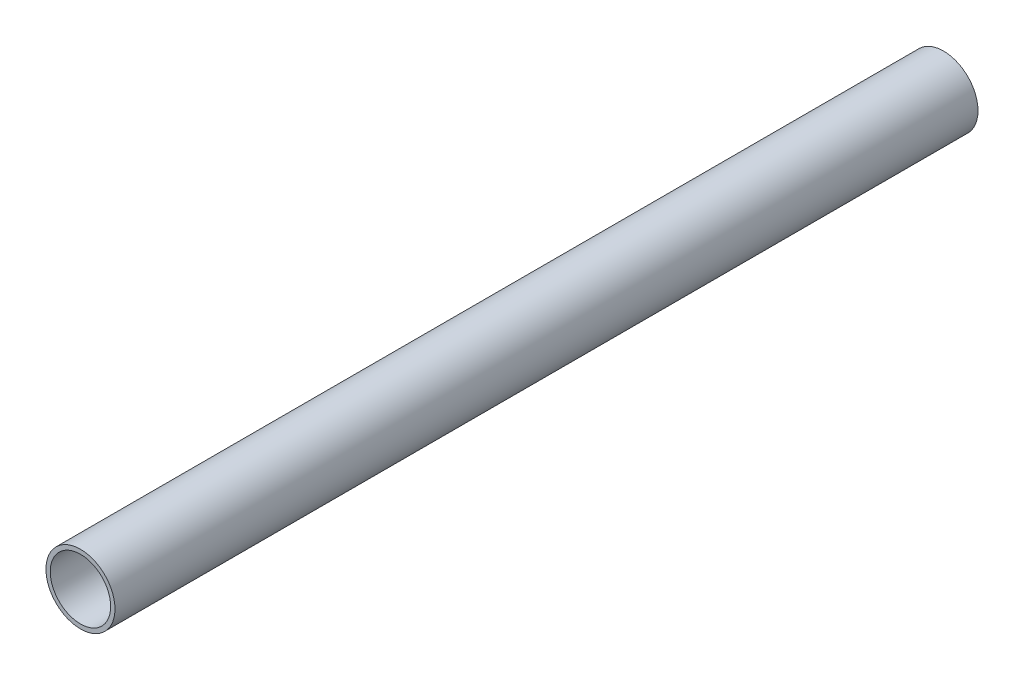
ISO-10303-21;
HEADER;
FILE_DESCRIPTION(('STEP AP214'),'2;1');
FILE_NAME('part.step','',(''),(''),'','','');
FILE_SCHEMA(('AUTOMOTIVE_DESIGN { 1 0 10303 214 1 1 1 1 }'));
ENDSEC;
DATA;
#1=APPLICATION_CONTEXT('core data for automotive mechanical design processes');
#2=APPLICATION_PROTOCOL_DEFINITION('international standard','automotive_design',2000,#1);
#3=PRODUCT_CONTEXT('',#1,'mechanical');
#4=PRODUCT('Part','Part','',(#3));
#5=PRODUCT_RELATED_PRODUCT_CATEGORY('part','',(#4));
#6=PRODUCT_DEFINITION_FORMATION('','',#4);
#7=PRODUCT_DEFINITION_CONTEXT('part definition',#1,'design');
#8=PRODUCT_DEFINITION('design','',#6,#7);
#9=PRODUCT_DEFINITION_SHAPE('','',#8);
#10=(LENGTH_UNIT() NAMED_UNIT(*) SI_UNIT(.MILLI.,.METRE.));
#11=(NAMED_UNIT(*) PLANE_ANGLE_UNIT() SI_UNIT($,.RADIAN.));
#12=(NAMED_UNIT(*) SI_UNIT($,.STERADIAN.) SOLID_ANGLE_UNIT());
#13=UNCERTAINTY_MEASURE_WITH_UNIT(LENGTH_MEASURE(1.E-05),#10,'distance_accuracy_value','');
#14=(GEOMETRIC_REPRESENTATION_CONTEXT(3) GLOBAL_UNCERTAINTY_ASSIGNED_CONTEXT((#13)) GLOBAL_UNIT_ASSIGNED_CONTEXT((#10,
#11,#12)) REPRESENTATION_CONTEXT('',''));
#15=CARTESIAN_POINT('',(0.,0.,0.));
#16=DIRECTION('',(0.,0.,1.));
#17=DIRECTION('',(1.,0.,0.));
#18=AXIS2_PLACEMENT_3D('',#15,#16,#17);
#19=CARTESIAN_POINT('',(0.,0.,200.));
#20=DIRECTION('',(0.,0.,1.));
#21=DIRECTION('',(1.,0.,0.));
#22=AXIS2_PLACEMENT_3D('',#19,#20,#21);
#23=PLANE('',#22);
#24=CARTESIAN_POINT('',(0.,0.,200.));
#25=DIRECTION('',(0.,0.,1.));
#26=DIRECTION('',(1.,0.,0.));
#27=AXIS2_PLACEMENT_3D('',#24,#25,#26);
#28=CIRCLE('',#27,8.);
#29=CARTESIAN_POINT('',(8.,0.,200.));
#30=VERTEX_POINT('',#29);
#31=EDGE_CURVE('E10',#30,#30,#28,.T.);
#32=ORIENTED_EDGE('',*,*,#31,.T.);
#33=EDGE_LOOP('',(#32));
#34=FACE_BOUND('',#33,.T.);
#35=CARTESIAN_POINT('',(0.,0.,200.));
#36=DIRECTION('',(0.,0.,1.));
#37=DIRECTION('',(1.,0.,0.));
#38=AXIS2_PLACEMENT_3D('',#35,#36,#37);
#39=CIRCLE('',#38,7.);
#40=CARTESIAN_POINT('',(7.,0.,200.));
#41=VERTEX_POINT('',#40);
#42=EDGE_CURVE('E53',#41,#41,#39,.T.);
#43=ORIENTED_EDGE('',*,*,#42,.F.);
#44=EDGE_LOOP('',(#43));
#45=FACE_BOUND('',#44,.T.);
#46=ADVANCED_FACE('F39',(#34,#45),#23,.T.);
#47=CARTESIAN_POINT('',(0.,0.,0.));
#48=DIRECTION('',(0.,0.,1.));
#49=DIRECTION('',(1.,0.,0.));
#50=AXIS2_PLACEMENT_3D('',#47,#48,#49);
#51=PLANE('',#50);
#52=CARTESIAN_POINT('',(0.,0.,0.));
#53=DIRECTION('',(0.,0.,1.));
#54=DIRECTION('',(1.,0.,0.));
#55=AXIS2_PLACEMENT_3D('',#52,#53,#54);
#56=CIRCLE('',#55,8.);
#57=CARTESIAN_POINT('',(8.,0.,0.));
#58=VERTEX_POINT('',#57);
#59=EDGE_CURVE('E43',#58,#58,#56,.T.);
#60=ORIENTED_EDGE('',*,*,#59,.F.);
#61=EDGE_LOOP('',(#60));
#62=FACE_BOUND('',#61,.T.);
#63=CARTESIAN_POINT('',(0.,0.,0.));
#64=DIRECTION('',(0.,0.,1.));
#65=DIRECTION('',(1.,0.,0.));
#66=AXIS2_PLACEMENT_3D('',#63,#64,#65);
#67=CIRCLE('',#66,7.);
#68=CARTESIAN_POINT('',(7.,0.,0.));
#69=VERTEX_POINT('',#68);
#70=EDGE_CURVE('E57',#69,#69,#67,.T.);
#71=ORIENTED_EDGE('',*,*,#70,.T.);
#72=EDGE_LOOP('',(#71));
#73=FACE_BOUND('',#72,.T.);
#74=ADVANCED_FACE('F67',(#62,#73),#51,.F.);
#75=CARTESIAN_POINT('',(0.,0.,200.));
#76=DIRECTION('',(0.,0.,-1.));
#77=DIRECTION('',(-1.,0.,0.));
#78=AXIS2_PLACEMENT_3D('',#75,#76,#77);
#79=CYLINDRICAL_SURFACE('',#78,8.);
#80=ORIENTED_EDGE('',*,*,#31,.F.);
#81=EDGE_LOOP('',(#80));
#82=FACE_BOUND('',#81,.T.);
#83=ORIENTED_EDGE('',*,*,#59,.T.);
#84=EDGE_LOOP('',(#83));
#85=FACE_BOUND('',#84,.T.);
#86=ADVANCED_FACE('F41',(#82,#85),#79,.T.);
#87=CARTESIAN_POINT('',(0.,0.,200.));
#88=DIRECTION('',(0.,0.,-1.));
#89=DIRECTION('',(-1.,0.,0.));
#90=AXIS2_PLACEMENT_3D('',#87,#88,#89);
#91=CYLINDRICAL_SURFACE('',#90,7.);
#92=ORIENTED_EDGE('',*,*,#42,.T.);
#93=EDGE_LOOP('',(#92));
#94=FACE_BOUND('',#93,.T.);
#95=ORIENTED_EDGE('',*,*,#70,.F.);
#96=EDGE_LOOP('',(#95));
#97=FACE_BOUND('',#96,.T.);
#98=ADVANCED_FACE('F63',(#94,#97),#91,.F.);
#99=CLOSED_SHELL('',(#46,#74,#86,#98));
#100=MANIFOLD_SOLID_BREP('B2',#99);
#101=ADVANCED_BREP_SHAPE_REPRESENTATION('',(#18,#100),#14);
#102=SHAPE_DEFINITION_REPRESENTATION(#9,#101);
ENDSEC;
END-ISO-10303-21;
